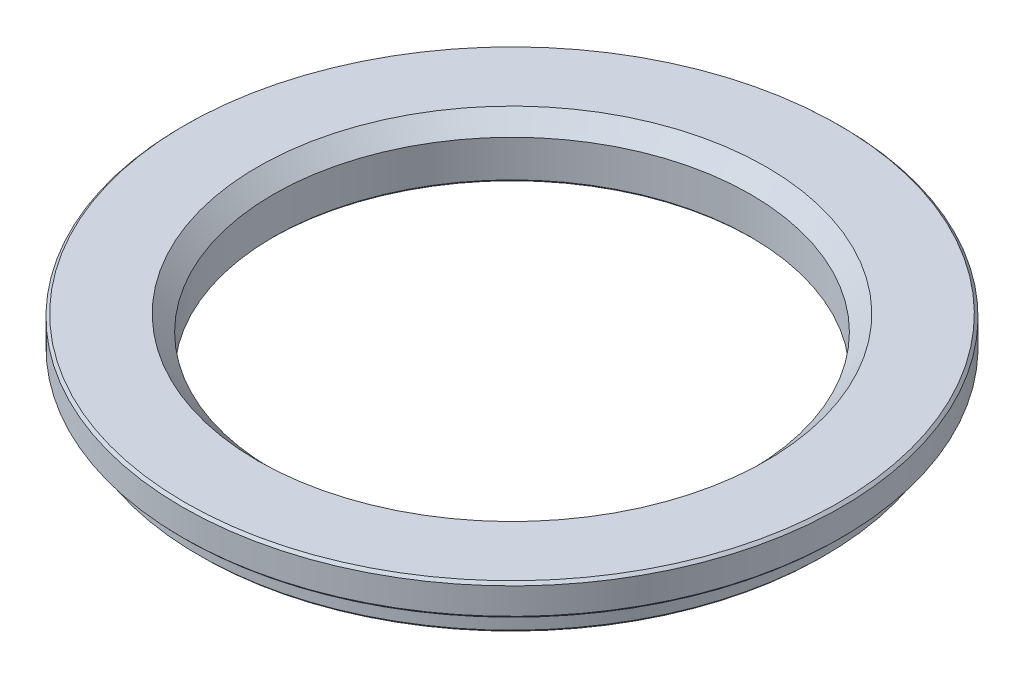
ISO-10303-21;
HEADER;
FILE_DESCRIPTION(('STEP AP214'),'2;1');
FILE_NAME('part.step','',(''),(''),'','','');
FILE_SCHEMA(('AUTOMOTIVE_DESIGN { 1 0 10303 214 1 1 1 1 }'));
ENDSEC;
DATA;
#1=APPLICATION_CONTEXT('core data for automotive mechanical design processes');
#2=APPLICATION_PROTOCOL_DEFINITION('international standard','automotive_design',2000,#1);
#3=PRODUCT_CONTEXT('',#1,'mechanical');
#4=PRODUCT('Part','Part','',(#3));
#5=PRODUCT_RELATED_PRODUCT_CATEGORY('part','',(#4));
#6=PRODUCT_DEFINITION_FORMATION('','',#4);
#7=PRODUCT_DEFINITION_CONTEXT('part definition',#1,'design');
#8=PRODUCT_DEFINITION('design','',#6,#7);
#9=PRODUCT_DEFINITION_SHAPE('','',#8);
#10=(LENGTH_UNIT() NAMED_UNIT(*) SI_UNIT(.MILLI.,.METRE.));
#11=(NAMED_UNIT(*) PLANE_ANGLE_UNIT() SI_UNIT($,.RADIAN.));
#12=(NAMED_UNIT(*) SI_UNIT($,.STERADIAN.) SOLID_ANGLE_UNIT());
#13=UNCERTAINTY_MEASURE_WITH_UNIT(LENGTH_MEASURE(1.E-05),#10,'distance_accuracy_value','');
#14=(GEOMETRIC_REPRESENTATION_CONTEXT(3) GLOBAL_UNCERTAINTY_ASSIGNED_CONTEXT((#13)) GLOBAL_UNIT_ASSIGNED_CONTEXT((#10,
#11,#12)) REPRESENTATION_CONTEXT('',''));
#15=CARTESIAN_POINT('',(0.,0.,0.));
#16=DIRECTION('',(0.,0.,1.));
#17=DIRECTION('',(1.,0.,0.));
#18=AXIS2_PLACEMENT_3D('',#15,#16,#17);
#19=CARTESIAN_POINT('',(0.,-46.0251937984496,0.));
#20=DIRECTION('',(0.,-1.,0.));
#21=DIRECTION('',(0.,0.,-1.));
#22=AXIS2_PLACEMENT_3D('',#19,#20,#21);
#23=CYLINDRICAL_SURFACE('',#22,45.25);
#24=CARTESIAN_POINT('',(0.,-0.555869324474018,0.));
#25=DIRECTION('',(0.,-1.,0.));
#26=DIRECTION('',(0.,0.,-1.));
#27=AXIS2_PLACEMENT_3D('',#24,#25,#26);
#28=CIRCLE('',#27,45.25);
#29=CARTESIAN_POINT('',(0.,-0.555869324474018,-45.25));
#30=VERTEX_POINT('',#29);
#31=EDGE_CURVE('E10',#30,#30,#28,.T.);
#32=ORIENTED_EDGE('',*,*,#31,.T.);
#33=EDGE_LOOP('',(#32));
#34=FACE_BOUND('',#33,.T.);
#35=CARTESIAN_POINT('',(0.,6.44413067552603,0.));
#36=DIRECTION('',(0.,1.,0.));
#37=DIRECTION('',(0.,0.,1.));
#38=AXIS2_PLACEMENT_3D('',#35,#36,#37);
#39=CIRCLE('',#38,45.25);
#40=CARTESIAN_POINT('',(0.,6.44413067552603,45.25));
#41=VERTEX_POINT('',#40);
#42=EDGE_CURVE('E63',#41,#41,#39,.T.);
#43=ORIENTED_EDGE('',*,*,#42,.T.);
#44=EDGE_LOOP('',(#43));
#45=FACE_BOUND('',#44,.T.);
#46=ADVANCED_FACE('F31',(#34,#45),#23,.F.);
#47=CARTESIAN_POINT('',(45.25,9.44413067552601,0.));
#48=DIRECTION('',(0.,1.,0.));
#49=DIRECTION('',(0.,0.,1.));
#50=AXIS2_PLACEMENT_3D('',#47,#48,#49);
#51=PLANE('',#50);
#52=CARTESIAN_POINT('',(0.,9.44413067552601,0.));
#53=DIRECTION('',(0.,1.,0.));
#54=DIRECTION('',(0.,0.,1.));
#55=AXIS2_PLACEMENT_3D('',#52,#53,#54);
#56=CIRCLE('',#55,62.);
#57=CARTESIAN_POINT('',(0.,9.44413067552601,62.));
#58=VERTEX_POINT('',#57);
#59=EDGE_CURVE('E38',#58,#58,#56,.T.);
#60=ORIENTED_EDGE('',*,*,#59,.T.);
#61=EDGE_LOOP('',(#60));
#62=FACE_BOUND('',#61,.T.);
#63=CARTESIAN_POINT('',(0.,9.44413067552601,0.));
#64=DIRECTION('',(0.,1.,0.));
#65=DIRECTION('',(0.,0.,1.));
#66=AXIS2_PLACEMENT_3D('',#63,#64,#65);
#67=CIRCLE('',#66,48.25);
#68=CARTESIAN_POINT('',(0.,9.44413067552601,48.25));
#69=VERTEX_POINT('',#68);
#70=EDGE_CURVE('E66',#69,#69,#67,.F.);
#71=ORIENTED_EDGE('',*,*,#70,.T.);
#72=EDGE_LOOP('',(#71));
#73=FACE_BOUND('',#72,.T.);
#74=ADVANCED_FACE('F87',(#62,#73),#51,.T.);
#75=CARTESIAN_POINT('',(0.,-46.0251937984496,0.));
#76=DIRECTION('',(0.,-1.,0.));
#77=DIRECTION('',(0.,0.,-1.));
#78=AXIS2_PLACEMENT_3D('',#75,#76,#77);
#79=CYLINDRICAL_SURFACE('',#78,62.5);
#80=CARTESIAN_POINT('',(0.,3.94413067552605,0.));
#81=DIRECTION('',(0.,-1.,0.));
#82=DIRECTION('',(0.,0.,-1.));
#83=AXIS2_PLACEMENT_3D('',#80,#81,#82);
#84=CIRCLE('',#83,62.5);
#85=CARTESIAN_POINT('',(0.,3.94413067552605,-62.5));
#86=VERTEX_POINT('',#85);
#87=EDGE_CURVE('E42',#86,#86,#84,.F.);
#88=ORIENTED_EDGE('',*,*,#87,.T.);
#89=EDGE_LOOP('',(#88));
#90=FACE_BOUND('',#89,.T.);
#91=CARTESIAN_POINT('',(0.,8.94413067552606,0.));
#92=DIRECTION('',(0.,1.,0.));
#93=DIRECTION('',(0.,0.,1.));
#94=AXIS2_PLACEMENT_3D('',#91,#92,#93);
#95=CIRCLE('',#94,62.5);
#96=CARTESIAN_POINT('',(0.,8.94413067552606,62.5));
#97=VERTEX_POINT('',#96);
#98=EDGE_CURVE('E46',#97,#97,#95,.F.);
#99=ORIENTED_EDGE('',*,*,#98,.T.);
#100=EDGE_LOOP('',(#99));
#101=FACE_BOUND('',#100,.T.);
#102=ADVANCED_FACE('F77',(#90,#101),#79,.T.);
#103=CARTESIAN_POINT('',(62.5,3.44413067552601,0.));
#104=DIRECTION('',(0.,-1.,0.));
#105=DIRECTION('',(0.,0.,-1.));
#106=AXIS2_PLACEMENT_3D('',#103,#104,#105);
#107=PLANE('',#106);
#108=CARTESIAN_POINT('',(0.,3.44413067552601,0.));
#109=DIRECTION('',(0.,-1.,0.));
#110=DIRECTION('',(0.,0.,-1.));
#111=AXIS2_PLACEMENT_3D('',#108,#109,#110);
#112=CIRCLE('',#111,62.);
#113=CARTESIAN_POINT('',(0.,3.44413067552601,-62.));
#114=VERTEX_POINT('',#113);
#115=EDGE_CURVE('E51',#114,#114,#112,.T.);
#116=ORIENTED_EDGE('',*,*,#115,.T.);
#117=EDGE_LOOP('',(#116));
#118=FACE_BOUND('',#117,.T.);
#119=CARTESIAN_POINT('',(0.,3.44413067552601,0.));
#120=DIRECTION('',(0.,-1.,0.));
#121=DIRECTION('',(0.,0.,-1.));
#122=AXIS2_PLACEMENT_3D('',#119,#120,#121);
#123=CIRCLE('',#122,59.35642303433);
#124=CARTESIAN_POINT('',(0.,3.44413067552601,-59.35642303433));
#125=VERTEX_POINT('',#124);
#126=EDGE_CURVE('E69',#125,#125,#123,.T.);
#127=ORIENTED_EDGE('',*,*,#126,.F.);
#128=EDGE_LOOP('',(#127));
#129=FACE_BOUND('',#128,.T.);
#130=ADVANCED_FACE('F75',(#118,#129),#107,.T.);
#131=CARTESIAN_POINT('',(0.,-46.0251937984496,0.));
#132=DIRECTION('',(0.,-1.,0.));
#133=DIRECTION('',(0.,0.,-1.));
#134=AXIS2_PLACEMENT_3D('',#131,#132,#133);
#135=CYLINDRICAL_SURFACE('',#134,59.35642303433);
#136=CARTESIAN_POINT('',(0.,-0.555869324473962,0.));
#137=DIRECTION('',(0.,-1.,0.));
#138=DIRECTION('',(0.,0.,-1.));
#139=AXIS2_PLACEMENT_3D('',#136,#137,#138);
#140=CIRCLE('',#139,59.35642303433);
#141=CARTESIAN_POINT('',(0.,-0.555869324473962,-59.35642303433));
#142=VERTEX_POINT('',#141);
#143=EDGE_CURVE('E54',#142,#142,#140,.F.);
#144=ORIENTED_EDGE('',*,*,#143,.T.);
#145=EDGE_LOOP('',(#144));
#146=FACE_BOUND('',#145,.T.);
#147=ORIENTED_EDGE('',*,*,#126,.T.);
#148=EDGE_LOOP('',(#147));
#149=FACE_BOUND('',#148,.T.);
#150=ADVANCED_FACE('F73',(#146,#149),#135,.T.);
#151=CARTESIAN_POINT('',(59.35642303433,-1.05586932447399,0.));
#152=DIRECTION('',(0.,-1.,0.));
#153=DIRECTION('',(0.,0.,-1.));
#154=AXIS2_PLACEMENT_3D('',#151,#152,#153);
#155=PLANE('',#154);
#156=CARTESIAN_POINT('',(0.,-1.05586932447399,0.));
#157=DIRECTION('',(0.,-1.,0.));
#158=DIRECTION('',(0.,0.,-1.));
#159=AXIS2_PLACEMENT_3D('',#156,#157,#158);
#160=CIRCLE('',#159,58.85642303433);
#161=CARTESIAN_POINT('',(0.,-1.05586932447399,-58.85642303433));
#162=VERTEX_POINT('',#161);
#163=EDGE_CURVE('E57',#162,#162,#160,.T.);
#164=ORIENTED_EDGE('',*,*,#163,.T.);
#165=EDGE_LOOP('',(#164));
#166=FACE_BOUND('',#165,.T.);
#167=CARTESIAN_POINT('',(0.,-1.05586932447399,0.));
#168=DIRECTION('',(0.,-1.,0.));
#169=DIRECTION('',(0.,0.,-1.));
#170=AXIS2_PLACEMENT_3D('',#167,#168,#169);
#171=CIRCLE('',#170,45.75);
#172=CARTESIAN_POINT('',(0.,-1.05586932447399,-45.75));
#173=VERTEX_POINT('',#172);
#174=EDGE_CURVE('E60',#173,#173,#171,.F.);
#175=ORIENTED_EDGE('',*,*,#174,.T.);
#176=EDGE_LOOP('',(#175));
#177=FACE_BOUND('',#176,.T.);
#178=ADVANCED_FACE('F84',(#166,#177),#155,.T.);
#179=CARTESIAN_POINT('',(0.,9.44413067552601,0.));
#180=DIRECTION('',(0.,1.,0.));
#181=DIRECTION('',(0.,0.,1.));
#182=AXIS2_PLACEMENT_3D('',#179,#180,#181);
#183=CONICAL_SURFACE('',#182,48.25,0.785398163397447);
#184=ORIENTED_EDGE('',*,*,#42,.F.);
#185=EDGE_LOOP('',(#184));
#186=FACE_BOUND('',#185,.T.);
#187=ORIENTED_EDGE('',*,*,#70,.F.);
#188=EDGE_LOOP('',(#187));
#189=FACE_BOUND('',#188,.T.);
#190=ADVANCED_FACE('F98',(#186,#189),#183,.F.);
#191=CARTESIAN_POINT('',(0.,-1.05586932447399,0.));
#192=DIRECTION('',(0.,1.,0.));
#193=DIRECTION('',(0.,0.,1.));
#194=AXIS2_PLACEMENT_3D('',#191,#192,#193);
#195=CONICAL_SURFACE('',#194,58.85642303433,0.785398163397462);
#196=ORIENTED_EDGE('',*,*,#143,.F.);
#197=EDGE_LOOP('',(#196));
#198=FACE_BOUND('',#197,.T.);
#199=ORIENTED_EDGE('',*,*,#163,.F.);
#200=EDGE_LOOP('',(#199));
#201=FACE_BOUND('',#200,.T.);
#202=ADVANCED_FACE('F101',(#198,#201),#195,.T.);
#203=CARTESIAN_POINT('',(0.,3.44413067552601,0.));
#204=DIRECTION('',(0.,1.,0.));
#205=DIRECTION('',(0.,0.,1.));
#206=AXIS2_PLACEMENT_3D('',#203,#204,#205);
#207=CONICAL_SURFACE('',#206,62.,0.785398163397441);
#208=ORIENTED_EDGE('',*,*,#87,.F.);
#209=EDGE_LOOP('',(#208));
#210=FACE_BOUND('',#209,.T.);
#211=ORIENTED_EDGE('',*,*,#115,.F.);
#212=EDGE_LOOP('',(#211));
#213=FACE_BOUND('',#212,.T.);
#214=ADVANCED_FACE('F105',(#210,#213),#207,.T.);
#215=CARTESIAN_POINT('',(0.,8.94413067552606,0.));
#216=DIRECTION('',(0.,-1.,0.));
#217=DIRECTION('',(0.,0.,-1.));
#218=AXIS2_PLACEMENT_3D('',#215,#216,#217);
#219=CONICAL_SURFACE('',#218,62.5,0.785398163397469);
#220=ORIENTED_EDGE('',*,*,#59,.F.);
#221=EDGE_LOOP('',(#220));
#222=FACE_BOUND('',#221,.T.);
#223=ORIENTED_EDGE('',*,*,#98,.F.);
#224=EDGE_LOOP('',(#223));
#225=FACE_BOUND('',#224,.T.);
#226=ADVANCED_FACE('F108',(#222,#225),#219,.T.);
#227=CARTESIAN_POINT('',(0.,-0.555869324474018,0.));
#228=DIRECTION('',(0.,-1.,0.));
#229=DIRECTION('',(0.,0.,-1.));
#230=AXIS2_PLACEMENT_3D('',#227,#228,#229);
#231=CONICAL_SURFACE('',#230,45.25,0.785398163397462);
#232=ORIENTED_EDGE('',*,*,#174,.F.);
#233=EDGE_LOOP('',(#232));
#234=FACE_BOUND('',#233,.T.);
#235=ORIENTED_EDGE('',*,*,#31,.F.);
#236=EDGE_LOOP('',(#235));
#237=FACE_BOUND('',#236,.T.);
#238=ADVANCED_FACE('F33',(#234,#237),#231,.F.);
#239=CLOSED_SHELL('',(#46,#74,#102,#130,#150,#178,#190,#202,#214,#226,#238));
#240=MANIFOLD_SOLID_BREP('B2',#239);
#241=ADVANCED_BREP_SHAPE_REPRESENTATION('',(#18,#240),#14);
#242=SHAPE_DEFINITION_REPRESENTATION(#9,#241);
ENDSEC;
END-ISO-10303-21;
